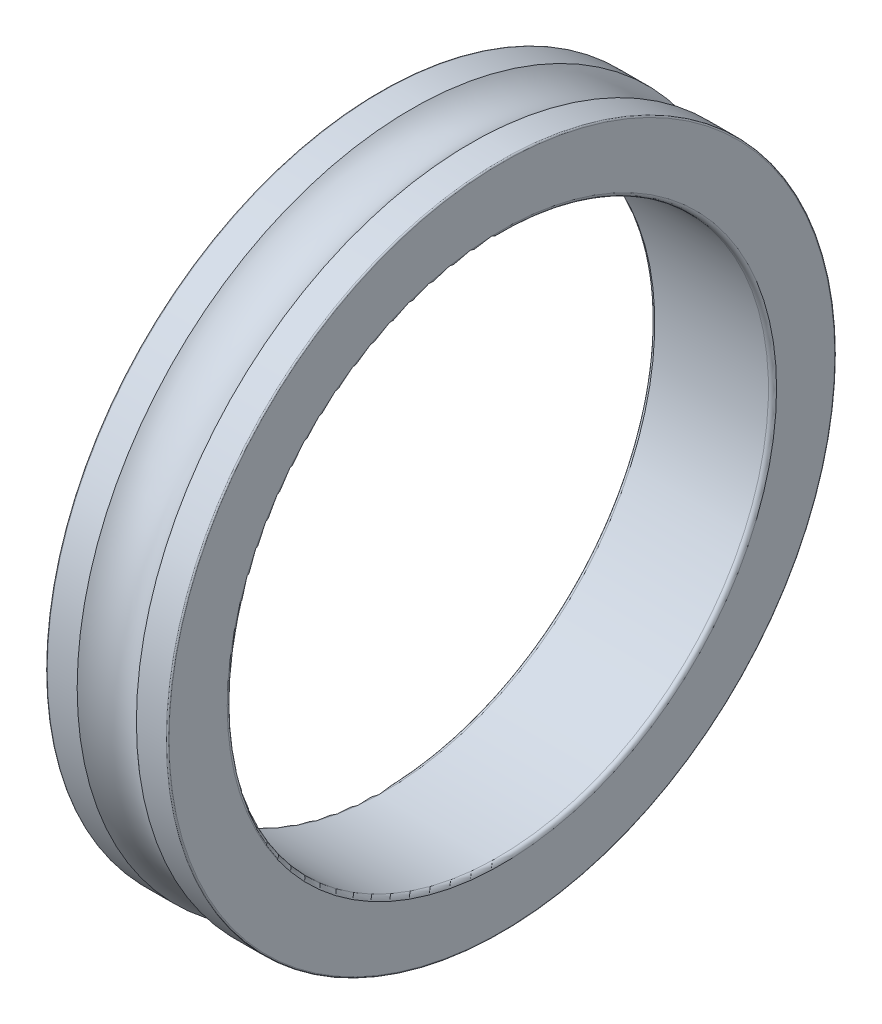
ISO-10303-21;
HEADER;
FILE_DESCRIPTION(('STEP AP214'),'2;1');
FILE_NAME('part.step','',(''),(''),'','','');
FILE_SCHEMA(('AUTOMOTIVE_DESIGN { 1 0 10303 214 1 1 1 1 }'));
ENDSEC;
DATA;
#1=APPLICATION_CONTEXT('core data for automotive mechanical design processes');
#2=APPLICATION_PROTOCOL_DEFINITION('international standard','automotive_design',2000,#1);
#3=PRODUCT_CONTEXT('',#1,'mechanical');
#4=PRODUCT('Part','Part','',(#3));
#5=PRODUCT_RELATED_PRODUCT_CATEGORY('part','',(#4));
#6=PRODUCT_DEFINITION_FORMATION('','',#4);
#7=PRODUCT_DEFINITION_CONTEXT('part definition',#1,'design');
#8=PRODUCT_DEFINITION('design','',#6,#7);
#9=PRODUCT_DEFINITION_SHAPE('','',#8);
#10=(LENGTH_UNIT() NAMED_UNIT(*) SI_UNIT(.MILLI.,.METRE.));
#11=(NAMED_UNIT(*) PLANE_ANGLE_UNIT() SI_UNIT($,.RADIAN.));
#12=(NAMED_UNIT(*) SI_UNIT($,.STERADIAN.) SOLID_ANGLE_UNIT());
#13=UNCERTAINTY_MEASURE_WITH_UNIT(LENGTH_MEASURE(1.E-05),#10,'distance_accuracy_value','');
#14=(GEOMETRIC_REPRESENTATION_CONTEXT(3) GLOBAL_UNCERTAINTY_ASSIGNED_CONTEXT((#13)) GLOBAL_UNIT_ASSIGNED_CONTEXT((#10,
#11,#12)) REPRESENTATION_CONTEXT('',''));
#15=CARTESIAN_POINT('',(0.,0.,0.));
#16=DIRECTION('',(0.,0.,1.));
#17=DIRECTION('',(1.,0.,0.));
#18=AXIS2_PLACEMENT_3D('',#15,#16,#17);
#19=CARTESIAN_POINT('',(0.,-25.0569780560725,-24.6));
#20=DIRECTION('',(-1.,0.,0.));
#21=DIRECTION('',(0.,0.,1.));
#22=AXIS2_PLACEMENT_3D('',#19,#20,#21);
#23=PLANE('',#22);
#24=CARTESIAN_POINT('',(0.,0.,0.));
#25=DIRECTION('',(-1.,0.,0.));
#26=DIRECTION('',(0.,0.,-1.));
#27=AXIS2_PLACEMENT_3D('',#24,#25,#26);
#28=CIRCLE('',#27,24.6);
#29=CARTESIAN_POINT('',(0.,0.,-24.6));
#30=VERTEX_POINT('',#29);
#31=EDGE_CURVE('E49',#30,#30,#28,.F.);
#32=ORIENTED_EDGE('',*,*,#31,.F.);
#33=EDGE_LOOP('',(#32));
#34=FACE_BOUND('',#33,.T.);
#35=CARTESIAN_POINT('',(0.,0.,0.));
#36=DIRECTION('',(1.,0.,0.));
#37=DIRECTION('',(0.,0.,1.));
#38=AXIS2_PLACEMENT_3D('',#35,#36,#37);
#39=CIRCLE('',#38,20.300000006322);
#40=CARTESIAN_POINT('',(0.,0.,20.300000006322));
#41=VERTEX_POINT('',#40);
#42=EDGE_CURVE('E46',#41,#41,#39,.T.);
#43=ORIENTED_EDGE('',*,*,#42,.T.);
#44=EDGE_LOOP('',(#43));
#45=FACE_BOUND('',#44,.T.);
#46=ADVANCED_FACE('F14',(#34,#45),#23,.T.);
#47=CARTESIAN_POINT('',(9.,-25.0569780560725,24.6));
#48=DIRECTION('',(1.,0.,0.));
#49=DIRECTION('',(0.,0.,-1.));
#50=AXIS2_PLACEMENT_3D('',#47,#48,#49);
#51=PLANE('',#50);
#52=CARTESIAN_POINT('',(9.,0.,0.));
#53=DIRECTION('',(1.,0.,0.));
#54=DIRECTION('',(0.,0.,1.));
#55=AXIS2_PLACEMENT_3D('',#52,#53,#54);
#56=CIRCLE('',#55,24.600000031751);
#57=CARTESIAN_POINT('',(9.,0.,24.600000031751));
#58=VERTEX_POINT('',#57);
#59=EDGE_CURVE('E43',#58,#58,#56,.T.);
#60=ORIENTED_EDGE('',*,*,#59,.T.);
#61=EDGE_LOOP('',(#60));
#62=FACE_BOUND('',#61,.T.);
#63=CARTESIAN_POINT('',(9.,0.,0.));
#64=DIRECTION('',(-1.,0.,0.));
#65=DIRECTION('',(0.,0.,-1.));
#66=AXIS2_PLACEMENT_3D('',#63,#64,#65);
#67=CIRCLE('',#66,20.3000000077429);
#68=CARTESIAN_POINT('',(9.,0.,-20.3000000077429));
#69=VERTEX_POINT('',#68);
#70=EDGE_CURVE('E40',#69,#69,#67,.F.);
#71=ORIENTED_EDGE('',*,*,#70,.F.);
#72=EDGE_LOOP('',(#71));
#73=FACE_BOUND('',#72,.T.);
#74=ADVANCED_FACE('F57',(#62,#73),#51,.T.);
#75=CARTESIAN_POINT('',(0.299999999999941,0.,0.));
#76=DIRECTION('',(1.,0.,0.));
#77=DIRECTION('',(0.,0.,1.));
#78=AXIS2_PLACEMENT_3D('',#75,#76,#77);
#79=TOROIDAL_SURFACE('',#78,20.3,0.299999999999941);
#80=CARTESIAN_POINT('',(0.299999999999994,0.,0.));
#81=DIRECTION('',(1.,0.,0.));
#82=DIRECTION('',(0.,0.,1.));
#83=AXIS2_PLACEMENT_3D('',#80,#81,#82);
#84=CIRCLE('',#83,20.0000000000001);
#85=CARTESIAN_POINT('',(0.299999999999994,0.,20.0000000000001));
#86=VERTEX_POINT('',#85);
#87=EDGE_CURVE('E37',#86,#86,#84,.T.);
#88=ORIENTED_EDGE('',*,*,#87,.T.);
#89=EDGE_LOOP('',(#88));
#90=FACE_BOUND('',#89,.T.);
#91=ORIENTED_EDGE('',*,*,#42,.F.);
#92=EDGE_LOOP('',(#91));
#93=FACE_BOUND('',#92,.T.);
#94=ADVANCED_FACE('F61',(#90,#93),#79,.T.);
#95=CARTESIAN_POINT('',(100.,0.,0.));
#96=DIRECTION('',(1.,0.,0.));
#97=DIRECTION('',(0.,0.,1.));
#98=AXIS2_PLACEMENT_3D('',#95,#96,#97);
#99=CYLINDRICAL_SURFACE('',#98,20.);
#100=CARTESIAN_POINT('',(8.7,0.,0.));
#101=DIRECTION('',(1.,0.,0.));
#102=DIRECTION('',(0.,0.,1.));
#103=AXIS2_PLACEMENT_3D('',#100,#101,#102);
#104=CIRCLE('',#103,20.);
#105=CARTESIAN_POINT('',(8.7,0.,20.));
#106=VERTEX_POINT('',#105);
#107=EDGE_CURVE('E34',#106,#106,#104,.T.);
#108=ORIENTED_EDGE('',*,*,#107,.T.);
#109=EDGE_LOOP('',(#108));
#110=FACE_BOUND('',#109,.T.);
#111=ORIENTED_EDGE('',*,*,#87,.F.);
#112=EDGE_LOOP('',(#111));
#113=FACE_BOUND('',#112,.T.);
#114=ADVANCED_FACE('F63',(#110,#113),#99,.F.);
#115=CARTESIAN_POINT('',(8.70000000000012,0.,0.));
#116=DIRECTION('',(1.,0.,0.));
#117=DIRECTION('',(0.,1.16851696131001E-09,1.));
#118=AXIS2_PLACEMENT_3D('',#115,#116,#117);
#119=TOROIDAL_SURFACE('',#118,20.3,0.29999999999988);
#120=ORIENTED_EDGE('',*,*,#70,.T.);
#121=EDGE_LOOP('',(#120));
#122=FACE_BOUND('',#121,.T.);
#123=ORIENTED_EDGE('',*,*,#107,.F.);
#124=EDGE_LOOP('',(#123));
#125=FACE_BOUND('',#124,.T.);
#126=ADVANCED_FACE('F71',(#122,#125),#119,.T.);
#127=CARTESIAN_POINT('',(8.90000000000067,0.,0.));
#128=DIRECTION('',(1.,0.,0.));
#129=DIRECTION('',(0.,0.,1.));
#130=AXIS2_PLACEMENT_3D('',#127,#128,#129);
#131=TOROIDAL_SURFACE('',#130,24.6000000000006,0.099999999999335);
#132=CARTESIAN_POINT('',(8.90000000000067,0.,0.));
#133=DIRECTION('',(1.,0.,0.));
#134=DIRECTION('',(0.,0.,1.));
#135=AXIS2_PLACEMENT_3D('',#132,#133,#134);
#136=CIRCLE('',#135,24.7);
#137=CARTESIAN_POINT('',(8.90000000000067,0.,24.7));
#138=VERTEX_POINT('',#137);
#139=EDGE_CURVE('E29',#138,#138,#136,.T.);
#140=ORIENTED_EDGE('',*,*,#139,.T.);
#141=EDGE_LOOP('',(#140));
#142=FACE_BOUND('',#141,.T.);
#143=ORIENTED_EDGE('',*,*,#59,.F.);
#144=EDGE_LOOP('',(#143));
#145=FACE_BOUND('',#144,.T.);
#146=ADVANCED_FACE('F79',(#142,#145),#131,.T.);
#147=CARTESIAN_POINT('',(100.,0.,0.));
#148=DIRECTION('',(1.,0.,0.));
#149=DIRECTION('',(0.,0.,1.));
#150=AXIS2_PLACEMENT_3D('',#147,#148,#149);
#151=CYLINDRICAL_SURFACE('',#150,24.7);
#152=CARTESIAN_POINT('',(6.6887496430611,0.,0.));
#153=DIRECTION('',(1.,0.,0.));
#154=DIRECTION('',(0.,0.,1.));
#155=AXIS2_PLACEMENT_3D('',#152,#153,#154);
#156=CIRCLE('',#155,24.7);
#157=CARTESIAN_POINT('',(6.6887496430611,0.,24.7));
#158=VERTEX_POINT('',#157);
#159=EDGE_CURVE('E25',#158,#158,#156,.T.);
#160=ORIENTED_EDGE('',*,*,#159,.T.);
#161=EDGE_LOOP('',(#160));
#162=FACE_BOUND('',#161,.T.);
#163=ORIENTED_EDGE('',*,*,#139,.F.);
#164=EDGE_LOOP('',(#163));
#165=FACE_BOUND('',#164,.T.);
#166=ADVANCED_FACE('F83',(#162,#165),#151,.T.);
#167=CARTESIAN_POINT('',(4.5,0.,0.));
#168=DIRECTION('',(1.,0.,0.));
#169=DIRECTION('',(0.,0.,1.));
#170=AXIS2_PLACEMENT_3D('',#167,#168,#169);
#171=TOROIDAL_SURFACE('',#170,27.,3.17500000000005);
#172=ORIENTED_EDGE('',*,*,#159,.F.);
#173=EDGE_LOOP('',(#172));
#174=FACE_BOUND('',#173,.T.);
#175=CARTESIAN_POINT('',(2.31125035693887,0.,0.));
#176=DIRECTION('',(1.,0.,0.));
#177=DIRECTION('',(0.,0.,1.));
#178=AXIS2_PLACEMENT_3D('',#175,#176,#177);
#179=CIRCLE('',#178,24.7);
#180=CARTESIAN_POINT('',(2.31125035693887,0.,24.7));
#181=VERTEX_POINT('',#180);
#182=EDGE_CURVE('E21',#181,#181,#179,.T.);
#183=ORIENTED_EDGE('',*,*,#182,.T.);
#184=EDGE_LOOP('',(#183));
#185=FACE_BOUND('',#184,.T.);
#186=ADVANCED_FACE('F87',(#174,#185),#171,.F.);
#187=CARTESIAN_POINT('',(100.,0.,0.));
#188=DIRECTION('',(1.,0.,0.));
#189=DIRECTION('',(0.,0.,1.));
#190=AXIS2_PLACEMENT_3D('',#187,#188,#189);
#191=CYLINDRICAL_SURFACE('',#190,24.7);
#192=CARTESIAN_POINT('',(0.100000000000009,0.,0.));
#193=DIRECTION('',(1.,0.,0.));
#194=DIRECTION('',(0.,0.,1.));
#195=AXIS2_PLACEMENT_3D('',#192,#193,#194);
#196=CIRCLE('',#195,24.7);
#197=CARTESIAN_POINT('',(0.100000000000009,0.,24.7));
#198=VERTEX_POINT('',#197);
#199=EDGE_CURVE('E10',#198,#198,#196,.T.);
#200=ORIENTED_EDGE('',*,*,#199,.T.);
#201=EDGE_LOOP('',(#200));
#202=FACE_BOUND('',#201,.T.);
#203=ORIENTED_EDGE('',*,*,#182,.F.);
#204=EDGE_LOOP('',(#203));
#205=FACE_BOUND('',#204,.T.);
#206=ADVANCED_FACE('F90',(#202,#205),#191,.T.);
#207=CARTESIAN_POINT('',(0.0999999999994098,0.,0.));
#208=DIRECTION('',(1.,0.,0.));
#209=DIRECTION('',(0.,0.,1.));
#210=AXIS2_PLACEMENT_3D('',#207,#208,#209);
#211=TOROIDAL_SURFACE('',#210,24.6000000000006,0.0999999999994096);
#212=ORIENTED_EDGE('',*,*,#31,.T.);
#213=EDGE_LOOP('',(#212));
#214=FACE_BOUND('',#213,.T.);
#215=ORIENTED_EDGE('',*,*,#199,.F.);
#216=EDGE_LOOP('',(#215));
#217=FACE_BOUND('',#216,.T.);
#218=ADVANCED_FACE('F16',(#214,#217),#211,.T.);
#219=CLOSED_SHELL('',(#46,#74,#94,#114,#126,#146,#166,#186,#206,#218));
#220=MANIFOLD_SOLID_BREP('B1',#219);
#221=ADVANCED_BREP_SHAPE_REPRESENTATION('',(#18,#220),#14);
#222=SHAPE_DEFINITION_REPRESENTATION(#9,#221);
ENDSEC;
END-ISO-10303-21;
